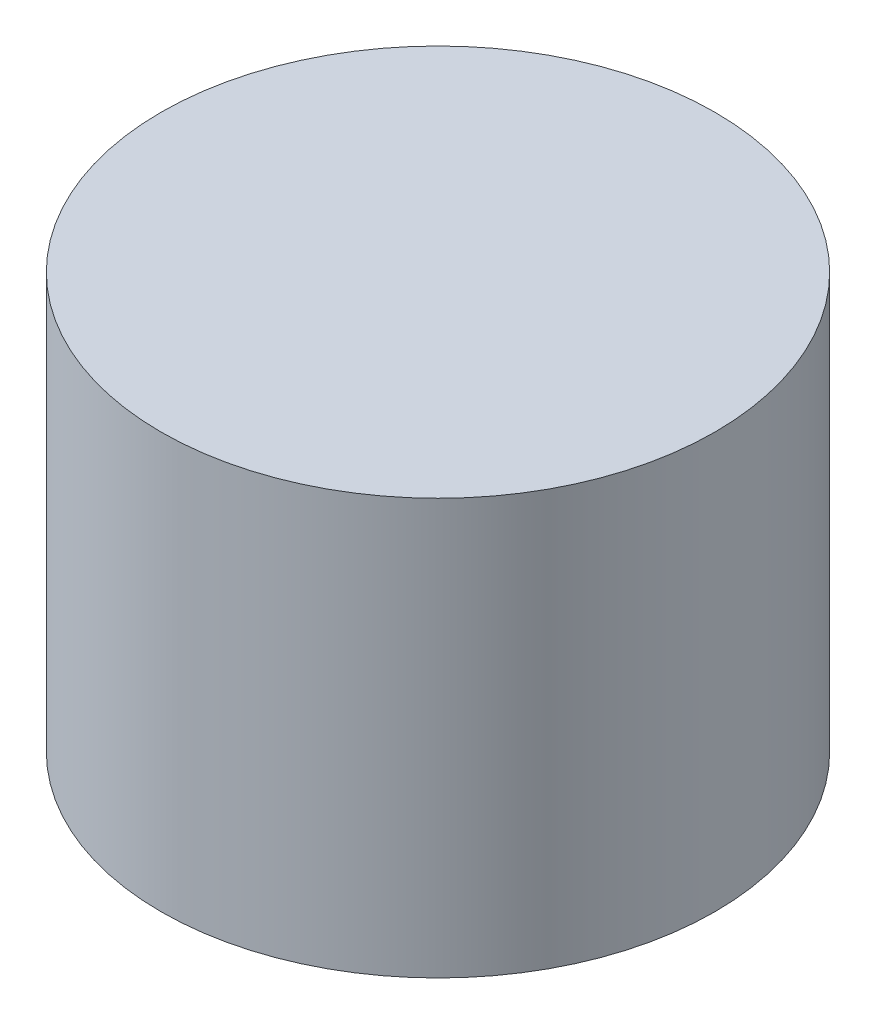
ISO-10303-21;
HEADER;
FILE_DESCRIPTION(('STEP AP214'),'2;1');
FILE_NAME('part.step','',(''),(''),'','','');
FILE_SCHEMA(('AUTOMOTIVE_DESIGN { 1 0 10303 214 1 1 1 1 }'));
ENDSEC;
DATA;
#1=APPLICATION_CONTEXT('core data for automotive mechanical design processes');
#2=APPLICATION_PROTOCOL_DEFINITION('international standard','automotive_design',2000,#1);
#3=PRODUCT_CONTEXT('',#1,'mechanical');
#4=PRODUCT('Part','Part','',(#3));
#5=PRODUCT_RELATED_PRODUCT_CATEGORY('part','',(#4));
#6=PRODUCT_DEFINITION_FORMATION('','',#4);
#7=PRODUCT_DEFINITION_CONTEXT('part definition',#1,'design');
#8=PRODUCT_DEFINITION('design','',#6,#7);
#9=PRODUCT_DEFINITION_SHAPE('','',#8);
#10=(LENGTH_UNIT() NAMED_UNIT(*) SI_UNIT(.MILLI.,.METRE.));
#11=(NAMED_UNIT(*) PLANE_ANGLE_UNIT() SI_UNIT($,.RADIAN.));
#12=(NAMED_UNIT(*) SI_UNIT($,.STERADIAN.) SOLID_ANGLE_UNIT());
#13=UNCERTAINTY_MEASURE_WITH_UNIT(LENGTH_MEASURE(1.E-05),#10,'distance_accuracy_value','');
#14=(GEOMETRIC_REPRESENTATION_CONTEXT(3) GLOBAL_UNCERTAINTY_ASSIGNED_CONTEXT((#13)) GLOBAL_UNIT_ASSIGNED_CONTEXT((#10,
#11,#12)) REPRESENTATION_CONTEXT('',''));
#15=CARTESIAN_POINT('',(0.,0.,0.));
#16=DIRECTION('',(0.,0.,1.));
#17=DIRECTION('',(1.,0.,0.));
#18=AXIS2_PLACEMENT_3D('',#15,#16,#17);
#19=CARTESIAN_POINT('',(0.,15.,0.));
#20=DIRECTION('',(0.,-1.,0.));
#21=DIRECTION('',(0.,0.,-1.));
#22=AXIS2_PLACEMENT_3D('',#19,#20,#21);
#23=CYLINDRICAL_SURFACE('',#22,10.);
#24=CARTESIAN_POINT('',(0.,15.,0.));
#25=DIRECTION('',(0.,1.,0.));
#26=DIRECTION('',(0.,0.,1.));
#27=AXIS2_PLACEMENT_3D('',#24,#25,#26);
#28=CIRCLE('',#27,10.);
#29=CARTESIAN_POINT('',(0.,15.,10.));
#30=VERTEX_POINT('',#29);
#31=EDGE_CURVE('E10',#30,#30,#28,.T.);
#32=ORIENTED_EDGE('',*,*,#31,.F.);
#33=EDGE_LOOP('',(#32));
#34=FACE_BOUND('',#33,.T.);
#35=CARTESIAN_POINT('',(0.,0.,0.));
#36=DIRECTION('',(0.,1.,0.));
#37=DIRECTION('',(0.,0.,1.));
#38=AXIS2_PLACEMENT_3D('',#35,#36,#37);
#39=CIRCLE('',#38,10.);
#40=CARTESIAN_POINT('',(0.,0.,10.));
#41=VERTEX_POINT('',#40);
#42=EDGE_CURVE('E40',#41,#41,#39,.T.);
#43=ORIENTED_EDGE('',*,*,#42,.T.);
#44=EDGE_LOOP('',(#43));
#45=FACE_BOUND('',#44,.T.);
#46=ADVANCED_FACE('F37',(#34,#45),#23,.T.);
#47=CARTESIAN_POINT('',(0.,15.,0.));
#48=DIRECTION('',(0.,1.,0.));
#49=DIRECTION('',(0.,0.,1.));
#50=AXIS2_PLACEMENT_3D('',#47,#48,#49);
#51=PLANE('',#50);
#52=ORIENTED_EDGE('',*,*,#31,.T.);
#53=EDGE_LOOP('',(#52));
#54=FACE_BOUND('',#53,.T.);
#55=ADVANCED_FACE('F54',(#54),#51,.T.);
#56=CARTESIAN_POINT('',(0.,0.,0.));
#57=DIRECTION('',(0.,1.,0.));
#58=DIRECTION('',(0.,0.,1.));
#59=AXIS2_PLACEMENT_3D('',#56,#57,#58);
#60=PLANE('',#59);
#61=ORIENTED_EDGE('',*,*,#42,.F.);
#62=EDGE_LOOP('',(#61));
#63=FACE_BOUND('',#62,.T.);
#64=ADVANCED_FACE('F52',(#63),#60,.F.);
#65=CLOSED_SHELL('',(#46,#55,#64));
#66=MANIFOLD_SOLID_BREP('B2',#65);
#67=ADVANCED_BREP_SHAPE_REPRESENTATION('',(#18,#66),#14);
#68=SHAPE_DEFINITION_REPRESENTATION(#9,#67);
ENDSEC;
END-ISO-10303-21;
